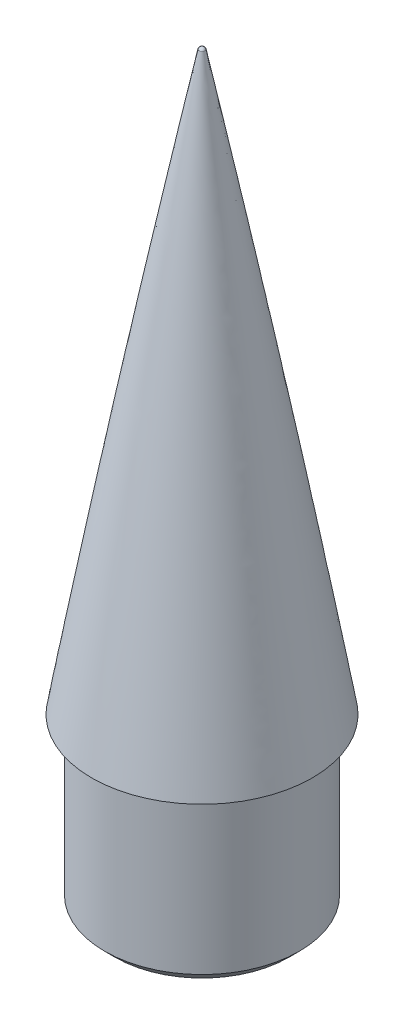
ISO-10303-21;
HEADER;
FILE_DESCRIPTION(('STEP AP214'),'2;1');
FILE_NAME('part.step','',(''),(''),'','','');
FILE_SCHEMA(('AUTOMOTIVE_DESIGN { 1 0 10303 214 1 1 1 1 }'));
ENDSEC;
DATA;
#1=APPLICATION_CONTEXT('core data for automotive mechanical design processes');
#2=APPLICATION_PROTOCOL_DEFINITION('international standard','automotive_design',2000,#1);
#3=PRODUCT_CONTEXT('',#1,'mechanical');
#4=PRODUCT('Part','Part','',(#3));
#5=PRODUCT_RELATED_PRODUCT_CATEGORY('part','',(#4));
#6=PRODUCT_DEFINITION_FORMATION('','',#4);
#7=PRODUCT_DEFINITION_CONTEXT('part definition',#1,'design');
#8=PRODUCT_DEFINITION('design','',#6,#7);
#9=PRODUCT_DEFINITION_SHAPE('','',#8);
#10=(LENGTH_UNIT() NAMED_UNIT(*) SI_UNIT(.MILLI.,.METRE.));
#11=(NAMED_UNIT(*) PLANE_ANGLE_UNIT() SI_UNIT($,.RADIAN.));
#12=(NAMED_UNIT(*) SI_UNIT($,.STERADIAN.) SOLID_ANGLE_UNIT());
#13=UNCERTAINTY_MEASURE_WITH_UNIT(LENGTH_MEASURE(1.E-05),#10,'distance_accuracy_value','');
#14=(GEOMETRIC_REPRESENTATION_CONTEXT(3) GLOBAL_UNCERTAINTY_ASSIGNED_CONTEXT((#13)) GLOBAL_UNIT_ASSIGNED_CONTEXT((#10,
#11,#12)) REPRESENTATION_CONTEXT('',''));
#15=CARTESIAN_POINT('',(0.,0.,0.));
#16=DIRECTION('',(0.,0.,1.));
#17=DIRECTION('',(1.,0.,0.));
#18=AXIS2_PLACEMENT_3D('',#15,#16,#17);
#19=CARTESIAN_POINT('',(0.,142.256244591914,0.553284138201987));
#20=CARTESIAN_POINT('',(-0.553284138201987,142.256244591914,0.553284138201987));
#21=CARTESIAN_POINT('',(-0.553284138201987,142.256244591914,0.));
#22=CARTESIAN_POINT('',(-0.553284138201987,142.256244591914,-0.553284138201987));
#23=CARTESIAN_POINT('',(0.,142.256244591914,-0.553284138201987));
#24=CARTESIAN_POINT('',(0.553284138201987,142.256244591914,-0.553284138201987));
#25=CARTESIAN_POINT('',(0.553284138201987,142.256244591914,0.));
#26=CARTESIAN_POINT('',(0.553284138201987,142.256244591914,0.553284138201987));
#27=CARTESIAN_POINT('',(0.,142.256244591914,0.553284138201987));
#28=CARTESIAN_POINT('',(0.,87.2739020755232,11.6203566655513));
#29=CARTESIAN_POINT('',(-11.6203566655513,87.2739020755233,11.6203566655513));
#30=CARTESIAN_POINT('',(-11.6203566655513,87.2739020755231,0.));
#31=CARTESIAN_POINT('',(-11.6203566655513,87.2739020755231,-11.6203566655513));
#32=CARTESIAN_POINT('',(0.,87.2739020755231,-11.6203566655513));
#33=CARTESIAN_POINT('',(11.6203566655513,87.2739020755231,-11.6203566655513));
#34=CARTESIAN_POINT('',(11.6203566655513,87.2739020755231,0.));
#35=CARTESIAN_POINT('',(11.6203566655513,87.2739020755233,11.6203566655513));
#36=CARTESIAN_POINT('',(0.,87.2739020755232,11.6203566655513));
#37=CARTESIAN_POINT('',(0.,32.0000000000137,21.124767865745));
#38=CARTESIAN_POINT('',(-21.124767865745,32.0000000000137,21.124767865745));
#39=CARTESIAN_POINT('',(-21.124767865745,32.0000000000136,0.));
#40=CARTESIAN_POINT('',(-21.124767865745,32.0000000000135,-21.124767865745));
#41=CARTESIAN_POINT('',(0.,32.0000000000135,-21.124767865745));
#42=CARTESIAN_POINT('',(21.124767865745,32.0000000000135,-21.124767865745));
#43=CARTESIAN_POINT('',(21.124767865745,32.0000000000136,0.));
#44=CARTESIAN_POINT('',(21.124767865745,32.0000000000137,21.124767865745));
#45=CARTESIAN_POINT('',(0.,32.0000000000137,21.124767865745));
#46=(BOUNDED_SURFACE() B_SPLINE_SURFACE(2,2,((#19,#20,#21,#22,#23,#24,#25,#26,#27),(#28,#29,#30,
#31,#32,#33,#34,#35,#36),(#37,#38,#39,#40,#41,#42,#43,#44,#45)),.UNSPECIFIED.,.F.,.T.,
.F.) B_SPLINE_SURFACE_WITH_KNOTS((3,3),(3,2,2,2,3),(-0.198629986875327,-0.170285892389519),
(-3.14159265358979,-1.5707963267949,0.,1.5707963267949,3.14159265358979),
.UNSPECIFIED.) GEOMETRIC_REPRESENTATION_ITEM() RATIONAL_B_SPLINE_SURFACE(((1.,0.707106781186548,
1.,0.707106781186548,1.,0.707106781186548,1.,0.707106781186548,1.),(0.999899578219273,
0.707035772264417,0.999899578219273,0.707035772264417,0.999899578219273,0.707035772264417,
0.999899578219273,0.707035772264417,0.999899578219273),(1.,0.707106781186548,1.,
0.707106781186548,1.,0.707106781186548,1.,0.707106781186548,1.))) REPRESENTATION_ITEM('') SURFACE());
#47=CARTESIAN_POINT('',(0.,32.0000000000132,0.));
#48=DIRECTION('',(0.,-1.,0.));
#49=DIRECTION('',(1.,0.,0.));
#50=AXIS2_PLACEMENT_3D('',#47,#48,#49);
#51=CIRCLE('',#50,21.1247678657447);
#52=CARTESIAN_POINT('',(21.1247678657447,32.0000000000132,0.));
#53=VERTEX_POINT('',#52);
#54=CARTESIAN_POINT('',(0.,32.0000000000133,21.1247678657447));
#55=VERTEX_POINT('',#54);
#56=EDGE_CURVE('E72',#53,#55,#51,.T.);
#57=CARTESIAN_POINT('',(0.,32.0000000000132,0.));
#58=DIRECTION('',(0.,-1.,0.));
#59=DIRECTION('',(1.,0.,0.));
#60=AXIS2_PLACEMENT_3D('',#57,#58,#59);
#61=CIRCLE('',#60,21.1247678657447);
#62=EDGE_CURVE('E26',#55,#53,#61,.T.);
#63=CARTESIAN_POINT('',(4.75018449746843E-13,-638.6,-3878.81999999975));
#64=DIRECTION('',(-1.,0.,0.));
#65=DIRECTION('',(0.,0.,1.));
#66=AXIS2_PLACEMENT_3D('',#63,#64,#65);
#67=CIRCLE('',#66,3957.18000000018);
#68=CARTESIAN_POINT('',(0.,142.256244591914,0.553284138202039));
#69=VERTEX_POINT('',#68);
#70=EDGE_CURVE('E11',#55,#69,#67,.T.);
#71=CARTESIAN_POINT('',(0.,142.256244591914,0.));
#72=DIRECTION('',(0.,-1.,0.));
#73=DIRECTION('',(0.,0.,-1.));
#74=AXIS2_PLACEMENT_3D('',#71,#72,#73);
#75=CIRCLE('',#74,0.553284138202039);
#76=EDGE_CURVE('E89',#69,#69,#75,.T.);
#77=ORIENTED_EDGE('',*,*,#56,.F.);
#78=ORIENTED_EDGE('',*,*,#62,.F.);
#79=ORIENTED_EDGE('',*,*,#70,.T.);
#80=ORIENTED_EDGE('',*,*,#76,.T.);
#81=ORIENTED_EDGE('',*,*,#70,.F.);
#82=EDGE_LOOP('',(#77,#78,#79,#80,#81));
#83=FACE_BOUND('',#82,.T.);
#84=ADVANCED_FACE('F16',(#83),#46,.F.);
#85=CARTESIAN_POINT('',(18.6247678657496,32.0000000000127,0.));
#86=DIRECTION('',(0.,-1.,0.));
#87=DIRECTION('',(0.,0.,-1.));
#88=AXIS2_PLACEMENT_3D('',#85,#86,#87);
#89=PLANE('',#88);
#90=CARTESIAN_POINT('',(0.,32.0000000000127,0.));
#91=DIRECTION('',(0.,-1.,0.));
#92=DIRECTION('',(1.,0.,0.));
#93=AXIS2_PLACEMENT_3D('',#90,#91,#92);
#94=CIRCLE('',#93,18.6247678657496);
#95=CARTESIAN_POINT('',(18.6247678657496,32.0000000000127,0.));
#96=VERTEX_POINT('',#95);
#97=CARTESIAN_POINT('',(-18.6247678657606,32.0000000000127,0.));
#98=VERTEX_POINT('',#97);
#99=EDGE_CURVE('E62',#96,#98,#94,.T.);
#100=ORIENTED_EDGE('',*,*,#99,.F.);
#101=CARTESIAN_POINT('',(0.,32.0000000000127,0.));
#102=DIRECTION('',(0.,-1.,0.));
#103=DIRECTION('',(1.,0.,0.));
#104=AXIS2_PLACEMENT_3D('',#101,#102,#103);
#105=CIRCLE('',#104,18.6247678657496);
#106=EDGE_CURVE('E69',#98,#96,#105,.T.);
#107=ORIENTED_EDGE('',*,*,#106,.F.);
#108=EDGE_LOOP('',(#100,#107));
#109=FACE_BOUND('',#108,.T.);
#110=ORIENTED_EDGE('',*,*,#56,.T.);
#111=ORIENTED_EDGE('',*,*,#62,.T.);
#112=EDGE_LOOP('',(#110,#111));
#113=FACE_BOUND('',#112,.T.);
#114=ADVANCED_FACE('F74',(#109,#113),#89,.T.);
#115=CARTESIAN_POINT('',(4.36095604072761E-10,0.,0.));
#116=DIRECTION('',(0.,-1.,0.));
#117=DIRECTION('',(0.,0.,-1.));
#118=AXIS2_PLACEMENT_3D('',#115,#116,#117);
#119=PLANE('',#118);
#120=CARTESIAN_POINT('',(0.,0.,0.));
#121=DIRECTION('',(0.,1.,0.));
#122=DIRECTION('',(-1.,0.,0.));
#123=AXIS2_PLACEMENT_3D('',#120,#121,#122);
#124=CIRCLE('',#123,16.6247678657715);
#125=CARTESIAN_POINT('',(16.6247678657715,0.,0.));
#126=VERTEX_POINT('',#125);
#127=EDGE_CURVE('E92',#126,#126,#124,.T.);
#128=ORIENTED_EDGE('',*,*,#127,.F.);
#129=EDGE_LOOP('',(#128));
#130=FACE_BOUND('',#129,.T.);
#131=ADVANCED_FACE('F112',(#130),#119,.T.);
#132=CARTESIAN_POINT('',(0.,16.0000000000127,0.));
#133=DIRECTION('',(0.,-1.,0.));
#134=DIRECTION('',(1.,0.,0.));
#135=AXIS2_PLACEMENT_3D('',#132,#133,#134);
#136=CYLINDRICAL_SURFACE('',#135,18.6247678657606);
#137=CARTESIAN_POINT('',(0.,2.00000000001265,0.));
#138=DIRECTION('',(0.,-1.,0.));
#139=DIRECTION('',(-1.,0.,0.));
#140=AXIS2_PLACEMENT_3D('',#137,#138,#139);
#141=CIRCLE('',#140,18.6247678657606);
#142=CARTESIAN_POINT('',(18.6247678657606,2.00000000001265,0.));
#143=VERTEX_POINT('',#142);
#144=CARTESIAN_POINT('',(-18.6247678657606,2.00000000001265,0.));
#145=VERTEX_POINT('',#144);
#146=EDGE_CURVE('E85',#143,#145,#141,.T.);
#147=ORIENTED_EDGE('',*,*,#146,.F.);
#148=CARTESIAN_POINT('',(0.,2.00000000001265,0.));
#149=DIRECTION('',(0.,-1.,0.));
#150=DIRECTION('',(-1.,0.,0.));
#151=AXIS2_PLACEMENT_3D('',#148,#149,#150);
#152=CIRCLE('',#151,18.6247678657606);
#153=EDGE_CURVE('E78',#145,#143,#152,.T.);
#154=ORIENTED_EDGE('',*,*,#153,.F.);
#155=DIRECTION('',(0.,1.,0.));
#156=VECTOR('',#155,1.);
#157=CARTESIAN_POINT('',(-18.6247678657606,16.0000000000127,0.));
#158=LINE('',#157,#156);
#159=EDGE_CURVE('E67',#145,#98,#158,.T.);
#160=ORIENTED_EDGE('',*,*,#159,.T.);
#161=ORIENTED_EDGE('',*,*,#106,.T.);
#162=ORIENTED_EDGE('',*,*,#99,.T.);
#163=ORIENTED_EDGE('',*,*,#159,.F.);
#164=EDGE_LOOP('',(#147,#154,#160,#161,#162,#163));
#165=FACE_BOUND('',#164,.T.);
#166=ADVANCED_FACE('F65',(#165),#136,.T.);
#167=CARTESIAN_POINT('',(0.,1.00000000000632,0.));
#168=DIRECTION('',(0.,1.,0.));
#169=DIRECTION('',(-1.,0.,0.));
#170=AXIS2_PLACEMENT_3D('',#167,#168,#169);
#171=CONICAL_SURFACE('',#170,17.624767865766,0.785398163391553);
#172=ORIENTED_EDGE('',*,*,#127,.T.);
#173=DIRECTION('',(0.707106781182379,0.707106781190716,0.));
#174=VECTOR('',#173,1.);
#175=CARTESIAN_POINT('',(17.624767865766,1.00000000000632,0.));
#176=LINE('',#175,#174);
#177=EDGE_CURVE('E96',#126,#143,#176,.T.);
#178=ORIENTED_EDGE('',*,*,#177,.T.);
#179=ORIENTED_EDGE('',*,*,#146,.T.);
#180=ORIENTED_EDGE('',*,*,#153,.T.);
#181=ORIENTED_EDGE('',*,*,#177,.F.);
#182=EDGE_LOOP('',(#172,#178,#179,#180,#181));
#183=FACE_BOUND('',#182,.T.);
#184=ADVANCED_FACE('F18',(#183),#171,.T.);
#185=CARTESIAN_POINT('',(0.,142.070837956506,-1.10333076008828E-09));
#186=DIRECTION('',(0.,0.,1.));
#187=DIRECTION('',(1.,0.,0.));
#188=AXIS2_PLACEMENT_3D('',#185,#186,#187);
#189=SPHERICAL_SURFACE('',#188,0.583522885617501);
#190=CARTESIAN_POINT('',(0.,142.070837956506,-1.10333076008828E-09));
#191=DIRECTION('',(0.,-1.,0.));
#192=DIRECTION('',(0.,0.,-1.));
#193=AXIS2_PLACEMENT_3D('',#190,#191,#192);
#194=SPHERICAL_SURFACE('',#193,0.583522885617501);
#195=ORIENTED_EDGE('',*,*,#76,.F.);
#196=EDGE_LOOP('',(#195));
#197=FACE_BOUND('',#196,.T.);
#198=ADVANCED_FACE('F118',(#197),#194,.T.);
#199=CLOSED_SHELL('',(#84,#114,#131,#166,#184,#198));
#200=MANIFOLD_SOLID_BREP('B1',#199);
#201=ADVANCED_BREP_SHAPE_REPRESENTATION('',(#18,#200),#14);
#202=SHAPE_DEFINITION_REPRESENTATION(#9,#201);
ENDSEC;
END-ISO-10303-21;
